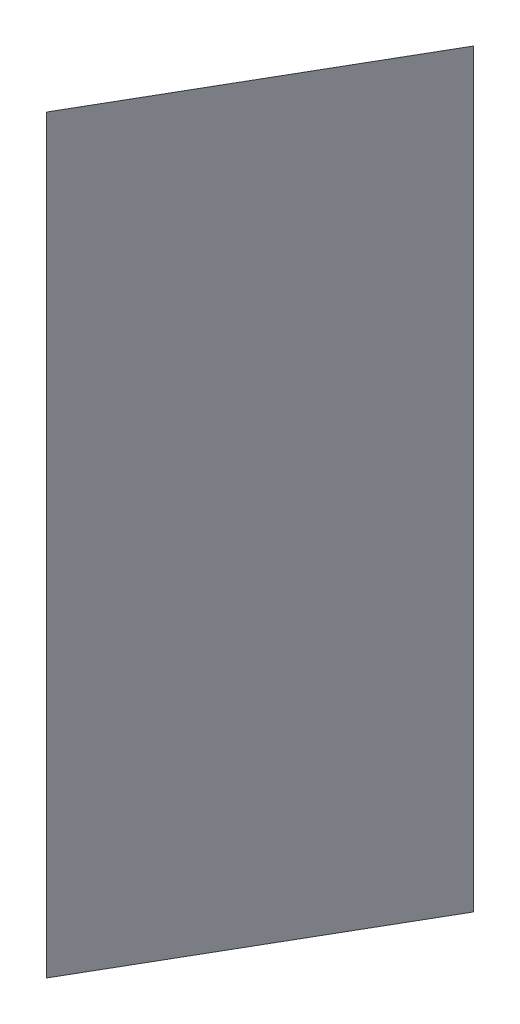
ISO-10303-21;
HEADER;
FILE_DESCRIPTION(('STEP AP214'),'2;1');
FILE_NAME('part.step','',(''),(''),'','','');
FILE_SCHEMA(('AUTOMOTIVE_DESIGN { 1 0 10303 214 1 1 1 1 }'));
ENDSEC;
DATA;
#1=APPLICATION_CONTEXT('core data for automotive mechanical design processes');
#2=APPLICATION_PROTOCOL_DEFINITION('international standard','automotive_design',2000,#1);
#3=PRODUCT_CONTEXT('',#1,'mechanical');
#4=PRODUCT('Part','Part','',(#3));
#5=PRODUCT_RELATED_PRODUCT_CATEGORY('part','',(#4));
#6=PRODUCT_DEFINITION_FORMATION('','',#4);
#7=PRODUCT_DEFINITION_CONTEXT('part definition',#1,'design');
#8=PRODUCT_DEFINITION('design','',#6,#7);
#9=PRODUCT_DEFINITION_SHAPE('','',#8);
#10=(LENGTH_UNIT() NAMED_UNIT(*) SI_UNIT(.MILLI.,.METRE.));
#11=(NAMED_UNIT(*) PLANE_ANGLE_UNIT() SI_UNIT($,.RADIAN.));
#12=(NAMED_UNIT(*) SI_UNIT($,.STERADIAN.) SOLID_ANGLE_UNIT());
#13=UNCERTAINTY_MEASURE_WITH_UNIT(LENGTH_MEASURE(1.E-05),#10,'distance_accuracy_value','');
#14=(GEOMETRIC_REPRESENTATION_CONTEXT(3) GLOBAL_UNCERTAINTY_ASSIGNED_CONTEXT((#13)) GLOBAL_UNIT_ASSIGNED_CONTEXT((#10,
#11,#12)) REPRESENTATION_CONTEXT('',''));
#15=CARTESIAN_POINT('',(0.,0.,0.));
#16=DIRECTION('',(0.,0.,1.));
#17=DIRECTION('',(1.,0.,0.));
#18=AXIS2_PLACEMENT_3D('',#15,#16,#17);
#19=CARTESIAN_POINT('',(-90.5329222734684,360.,270.807621135332));
#20=DIRECTION('',(-0.49999999999922,0.,0.866025403784889));
#21=DIRECTION('',(0.,1.,0.));
#22=AXIS2_PLACEMENT_3D('',#19,#20,#21);
#23=PLANE('',#22);
#24=DIRECTION('',(0.,-1.,0.));
#25=VECTOR('',#24,1.);
#26=CARTESIAN_POINT('',(-90.5329222734684,360.,270.807621135332));
#27=LINE('',#26,#25);
#28=CARTESIAN_POINT('',(-90.5329222734684,360.,270.807621135332));
#29=VERTEX_POINT('',#28);
#30=CARTESIAN_POINT('',(-90.5329222734684,-360.,270.807621135332));
#31=VERTEX_POINT('',#30);
#32=EDGE_CURVE('E11',#29,#31,#27,.T.);
#33=ORIENTED_EDGE('',*,*,#32,.T.);
#34=DIRECTION('',(0.866025403784889,0.,0.49999999999922));
#35=VECTOR('',#34,1.);
#36=CARTESIAN_POINT('',(-90.5329222734684,-360.,270.807621135332));
#37=LINE('',#36,#35);
#38=CARTESIAN_POINT('',(-90.5242620194306,-360.,270.812621135332));
#39=VERTEX_POINT('',#38);
#40=EDGE_CURVE('E20',#31,#39,#37,.T.);
#41=ORIENTED_EDGE('',*,*,#40,.T.);
#42=DIRECTION('',(0.,-1.,0.));
#43=VECTOR('',#42,1.);
#44=CARTESIAN_POINT('',(-90.5242620194305,360.,270.812621135332));
#45=LINE('',#44,#43);
#46=CARTESIAN_POINT('',(-90.5242620194305,360.,270.812621135332));
#47=VERTEX_POINT('',#46);
#48=EDGE_CURVE('E86',#47,#39,#45,.T.);
#49=ORIENTED_EDGE('',*,*,#48,.F.);
#50=DIRECTION('',(0.866025403784889,0.,0.49999999999922));
#51=VECTOR('',#50,1.);
#52=CARTESIAN_POINT('',(-90.5329222734684,360.,270.807621135332));
#53=LINE('',#52,#51);
#54=EDGE_CURVE('E96',#29,#47,#53,.T.);
#55=ORIENTED_EDGE('',*,*,#54,.F.);
#56=EDGE_LOOP('',(#33,#41,#49,#55));
#57=FACE_BOUND('',#56,.T.);
#58=ADVANCED_FACE('F16',(#57),#23,.T.);
#59=CARTESIAN_POINT('',(59.4670777265314,360.,11.));
#60=DIRECTION('',(0.,1.,0.));
#61=DIRECTION('',(1.,0.,0.));
#62=AXIS2_PLACEMENT_3D('',#59,#60,#61);
#63=PLANE('',#62);
#64=DIRECTION('',(-0.5,0.,0.866025403784439));
#65=VECTOR('',#64,1.);
#66=CARTESIAN_POINT('',(59.4670777265314,360.,11.));
#67=LINE('',#66,#65);
#68=CARTESIAN_POINT('',(59.4670777265314,360.,11.));
#69=VERTEX_POINT('',#68);
#70=EDGE_CURVE('E107',#69,#29,#67,.T.);
#71=ORIENTED_EDGE('',*,*,#70,.T.);
#72=ORIENTED_EDGE('',*,*,#54,.T.);
#73=DIRECTION('',(-0.5,0.,0.866025403784439));
#74=VECTOR('',#73,1.);
#75=CARTESIAN_POINT('',(59.4757379805692,360.,11.005));
#76=LINE('',#75,#74);
#77=CARTESIAN_POINT('',(59.4757379805693,360.,11.005));
#78=VERTEX_POINT('',#77);
#79=EDGE_CURVE('E78',#78,#47,#76,.T.);
#80=ORIENTED_EDGE('',*,*,#79,.F.);
#81=DIRECTION('',(0.866025403784889,0.,0.49999999999922));
#82=VECTOR('',#81,1.);
#83=CARTESIAN_POINT('',(59.4670777265314,360.,11.));
#84=LINE('',#83,#82);
#85=EDGE_CURVE('E72',#69,#78,#84,.T.);
#86=ORIENTED_EDGE('',*,*,#85,.F.);
#87=EDGE_LOOP('',(#71,#72,#80,#86));
#88=FACE_BOUND('',#87,.T.);
#89=ADVANCED_FACE('F127',(#88),#63,.T.);
#90=CARTESIAN_POINT('',(59.4670777265314,-360.,11.));
#91=DIRECTION('',(0.49999999999922,0.,-0.866025403784889));
#92=DIRECTION('',(0.,-1.,0.));
#93=AXIS2_PLACEMENT_3D('',#90,#91,#92);
#94=PLANE('',#93);
#95=DIRECTION('',(0.,1.,0.));
#96=VECTOR('',#95,1.);
#97=CARTESIAN_POINT('',(59.4670777265314,-360.,11.));
#98=LINE('',#97,#96);
#99=CARTESIAN_POINT('',(59.4670777265314,-360.,11.));
#100=VERTEX_POINT('',#99);
#101=EDGE_CURVE('E93',#100,#69,#98,.T.);
#102=ORIENTED_EDGE('',*,*,#101,.T.);
#103=ORIENTED_EDGE('',*,*,#85,.T.);
#104=DIRECTION('',(0.,1.,0.));
#105=VECTOR('',#104,1.);
#106=CARTESIAN_POINT('',(59.4757379805692,-360.,11.005));
#107=LINE('',#106,#105);
#108=CARTESIAN_POINT('',(59.4757379805693,-360.,11.005));
#109=VERTEX_POINT('',#108);
#110=EDGE_CURVE('E70',#109,#78,#107,.T.);
#111=ORIENTED_EDGE('',*,*,#110,.F.);
#112=DIRECTION('',(0.866025403784889,0.,0.49999999999922));
#113=VECTOR('',#112,1.);
#114=CARTESIAN_POINT('',(59.4670777265314,-360.,11.));
#115=LINE('',#114,#113);
#116=EDGE_CURVE('E63',#100,#109,#115,.T.);
#117=ORIENTED_EDGE('',*,*,#116,.F.);
#118=EDGE_LOOP('',(#102,#103,#111,#117));
#119=FACE_BOUND('',#118,.T.);
#120=ADVANCED_FACE('F71',(#119),#94,.T.);
#121=CARTESIAN_POINT('',(-90.5329222734684,-360.,270.807621135332));
#122=DIRECTION('',(0.,-1.,0.));
#123=DIRECTION('',(0.,0.,-1.));
#124=AXIS2_PLACEMENT_3D('',#121,#122,#123);
#125=PLANE('',#124);
#126=DIRECTION('',(0.5,0.,-0.866025403784439));
#127=VECTOR('',#126,1.);
#128=CARTESIAN_POINT('',(-90.5329222734684,-360.,270.807621135332));
#129=LINE('',#128,#127);
#130=EDGE_CURVE('E82',#31,#100,#129,.T.);
#131=ORIENTED_EDGE('',*,*,#130,.T.);
#132=ORIENTED_EDGE('',*,*,#116,.T.);
#133=DIRECTION('',(0.5,0.,-0.866025403784439));
#134=VECTOR('',#133,1.);
#135=CARTESIAN_POINT('',(-90.5242620194306,-360.,270.812621135332));
#136=LINE('',#135,#134);
#137=EDGE_CURVE('E77',#39,#109,#136,.T.);
#138=ORIENTED_EDGE('',*,*,#137,.F.);
#139=ORIENTED_EDGE('',*,*,#40,.F.);
#140=EDGE_LOOP('',(#131,#132,#138,#139));
#141=FACE_BOUND('',#140,.T.);
#142=ADVANCED_FACE('F80',(#141),#125,.T.);
#143=CARTESIAN_POINT('',(-15.5242620195475,0.,140.908810567598));
#144=DIRECTION('',(0.866025403784889,0.,0.49999999999922));
#145=DIRECTION('',(0.,-1.,0.));
#146=AXIS2_PLACEMENT_3D('',#143,#144,#145);
#147=PLANE('',#146);
#148=ORIENTED_EDGE('',*,*,#137,.T.);
#149=ORIENTED_EDGE('',*,*,#110,.T.);
#150=ORIENTED_EDGE('',*,*,#79,.T.);
#151=ORIENTED_EDGE('',*,*,#48,.T.);
#152=EDGE_LOOP('',(#148,#149,#150,#151));
#153=FACE_BOUND('',#152,.T.);
#154=ADVANCED_FACE('F85',(#153),#147,.T.);
#155=CARTESIAN_POINT('',(-15.5329222734685,0.,140.903810567666));
#156=DIRECTION('',(0.866025403784439,0.,0.5));
#157=DIRECTION('',(0.,-1.,0.));
#158=AXIS2_PLACEMENT_3D('',#155,#156,#157);
#159=PLANE('',#158);
#160=ORIENTED_EDGE('',*,*,#130,.F.);
#161=ORIENTED_EDGE('',*,*,#32,.F.);
#162=ORIENTED_EDGE('',*,*,#70,.F.);
#163=ORIENTED_EDGE('',*,*,#101,.F.);
#164=EDGE_LOOP('',(#160,#161,#162,#163));
#165=FACE_BOUND('',#164,.T.);
#166=ADVANCED_FACE('F18',(#165),#159,.F.);
#167=CLOSED_SHELL('',(#58,#89,#120,#142,#154,#166));
#168=MANIFOLD_SOLID_BREP('B1',#167);
#169=ADVANCED_BREP_SHAPE_REPRESENTATION('',(#18,#168),#14);
#170=SHAPE_DEFINITION_REPRESENTATION(#9,#169);
ENDSEC;
END-ISO-10303-21;
